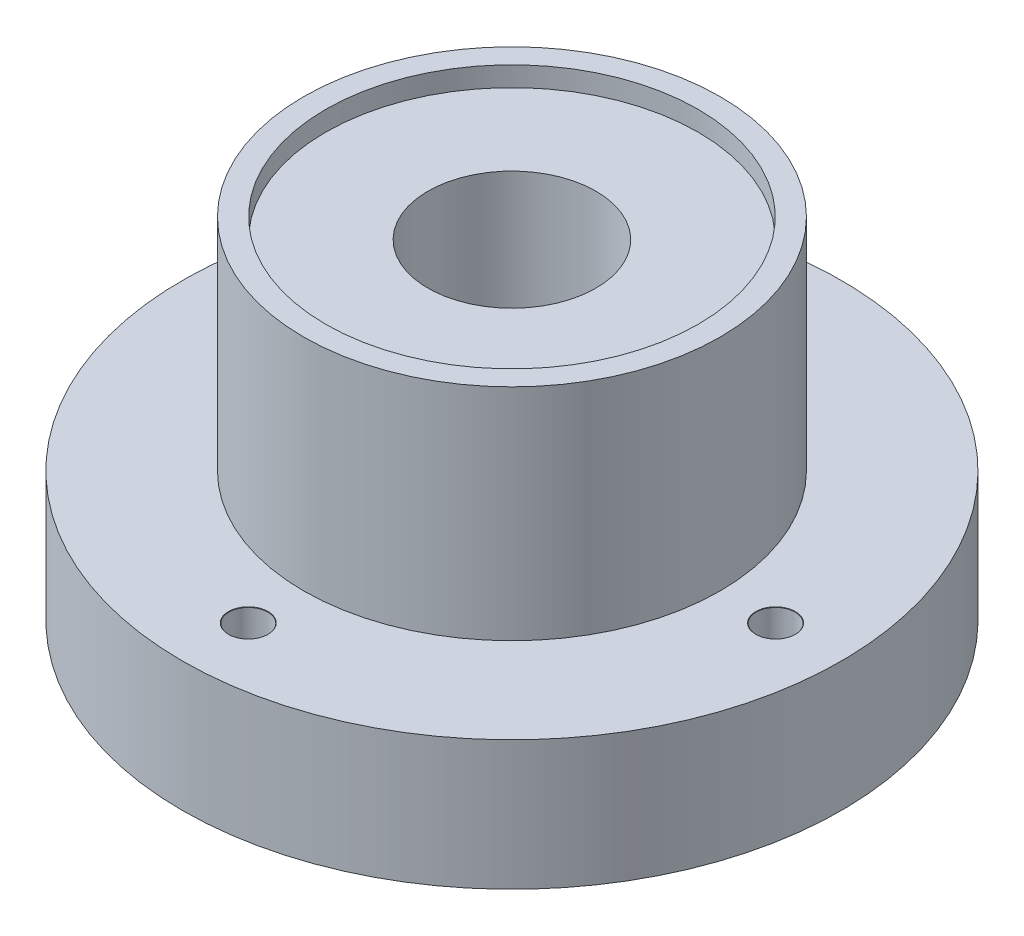
ISO-10303-21;
HEADER;
FILE_DESCRIPTION(('STEP AP214'),'2;1');
FILE_NAME('part.step','',(''),(''),'','','');
FILE_SCHEMA(('AUTOMOTIVE_DESIGN { 1 0 10303 214 1 1 1 1 }'));
ENDSEC;
DATA;
#1=APPLICATION_CONTEXT('core data for automotive mechanical design processes');
#2=APPLICATION_PROTOCOL_DEFINITION('international standard','automotive_design',2000,#1);
#3=PRODUCT_CONTEXT('',#1,'mechanical');
#4=PRODUCT('Part','Part','',(#3));
#5=PRODUCT_RELATED_PRODUCT_CATEGORY('part','',(#4));
#6=PRODUCT_DEFINITION_FORMATION('','',#4);
#7=PRODUCT_DEFINITION_CONTEXT('part definition',#1,'design');
#8=PRODUCT_DEFINITION('design','',#6,#7);
#9=PRODUCT_DEFINITION_SHAPE('','',#8);
#10=(LENGTH_UNIT() NAMED_UNIT(*) SI_UNIT(.MILLI.,.METRE.));
#11=(NAMED_UNIT(*) PLANE_ANGLE_UNIT() SI_UNIT($,.RADIAN.));
#12=(NAMED_UNIT(*) SI_UNIT($,.STERADIAN.) SOLID_ANGLE_UNIT());
#13=UNCERTAINTY_MEASURE_WITH_UNIT(LENGTH_MEASURE(1.E-05),#10,'distance_accuracy_value','');
#14=(GEOMETRIC_REPRESENTATION_CONTEXT(3) GLOBAL_UNCERTAINTY_ASSIGNED_CONTEXT((#13)) GLOBAL_UNIT_ASSIGNED_CONTEXT((#10,
#11,#12)) REPRESENTATION_CONTEXT('',''));
#15=CARTESIAN_POINT('',(0.,0.,0.));
#16=DIRECTION('',(0.,0.,1.));
#17=DIRECTION('',(1.,0.,0.));
#18=AXIS2_PLACEMENT_3D('',#15,#16,#17);
#19=CARTESIAN_POINT('',(0.,25.4,0.));
#20=DIRECTION('',(0.,1.,0.));
#21=DIRECTION('',(0.,0.,1.));
#22=AXIS2_PLACEMENT_3D('',#19,#20,#21);
#23=PLANE('',#22);
#24=CARTESIAN_POINT('',(0.,25.4,0.));
#25=DIRECTION('',(0.,-1.,0.));
#26=DIRECTION('',(0.,0.,-1.));
#27=AXIS2_PLACEMENT_3D('',#24,#25,#26);
#28=CIRCLE('',#27,6.477);
#29=CARTESIAN_POINT('',(0.,25.4,-6.477));
#30=VERTEX_POINT('',#29);
#31=EDGE_CURVE('E62',#30,#30,#28,.T.);
#32=ORIENTED_EDGE('',*,*,#31,.T.);
#33=EDGE_LOOP('',(#32));
#34=FACE_BOUND('',#33,.T.);
#35=CARTESIAN_POINT('',(0.,25.4,0.));
#36=DIRECTION('',(0.,1.,0.));
#37=DIRECTION('',(0.,0.,1.));
#38=AXIS2_PLACEMENT_3D('',#35,#36,#37);
#39=CIRCLE('',#38,14.351);
#40=CARTESIAN_POINT('',(0.,25.4,-14.351));
#41=VERTEX_POINT('',#40);
#42=EDGE_CURVE('E11',#41,#41,#39,.F.);
#43=ORIENTED_EDGE('',*,*,#42,.F.);
#44=EDGE_LOOP('',(#43));
#45=FACE_BOUND('',#44,.T.);
#46=ADVANCED_FACE('F38',(#34,#45),#23,.T.);
#47=CARTESIAN_POINT('',(0.,25.4,0.));
#48=DIRECTION('',(0.,-1.,0.));
#49=DIRECTION('',(0.,0.,-1.));
#50=AXIS2_PLACEMENT_3D('',#47,#48,#49);
#51=CYLINDRICAL_SURFACE('',#50,25.4);
#52=CARTESIAN_POINT('',(0.,0.,0.));
#53=DIRECTION('',(0.,1.,0.));
#54=DIRECTION('',(0.,0.,1.));
#55=AXIS2_PLACEMENT_3D('',#52,#53,#54);
#56=CIRCLE('',#55,25.4);
#57=CARTESIAN_POINT('',(0.,0.,25.4));
#58=VERTEX_POINT('',#57);
#59=EDGE_CURVE('E46',#58,#58,#56,.T.);
#60=ORIENTED_EDGE('',*,*,#59,.T.);
#61=EDGE_LOOP('',(#60));
#62=FACE_BOUND('',#61,.T.);
#63=CARTESIAN_POINT('',(0.,9.978,0.));
#64=DIRECTION('',(0.,1.,0.));
#65=DIRECTION('',(0.,0.,1.));
#66=AXIS2_PLACEMENT_3D('',#63,#64,#65);
#67=CIRCLE('',#66,25.4);
#68=CARTESIAN_POINT('',(0.,9.978,25.4));
#69=VERTEX_POINT('',#68);
#70=EDGE_CURVE('E51',#69,#69,#67,.T.);
#71=ORIENTED_EDGE('',*,*,#70,.F.);
#72=EDGE_LOOP('',(#71));
#73=FACE_BOUND('',#72,.T.);
#74=ADVANCED_FACE('F40',(#62,#73),#51,.T.);
#75=CARTESIAN_POINT('',(0.,0.,0.));
#76=DIRECTION('',(0.,1.,0.));
#77=DIRECTION('',(0.,0.,1.));
#78=AXIS2_PLACEMENT_3D('',#75,#76,#77);
#79=PLANE('',#78);
#80=CARTESIAN_POINT('',(20.32,0.,-2.15329184711745E-13));
#81=DIRECTION('',(0.,1.,0.));
#82=DIRECTION('',(0.,0.,1.));
#83=AXIS2_PLACEMENT_3D('',#80,#81,#82);
#84=CIRCLE('',#83,1.5);
#85=CARTESIAN_POINT('',(20.32,0.,1.49999999999978));
#86=VERTEX_POINT('',#85);
#87=EDGE_CURVE('E114',#86,#86,#84,.T.);
#88=ORIENTED_EDGE('',*,*,#87,.T.);
#89=EDGE_LOOP('',(#88));
#90=FACE_BOUND('',#89,.T.);
#91=CARTESIAN_POINT('',(0.,0.,20.32));
#92=DIRECTION('',(0.,1.,0.));
#93=DIRECTION('',(0.,0.,1.));
#94=AXIS2_PLACEMENT_3D('',#91,#92,#93);
#95=CIRCLE('',#94,1.5);
#96=CARTESIAN_POINT('',(0.,0.,21.82));
#97=VERTEX_POINT('',#96);
#98=EDGE_CURVE('E102',#97,#97,#95,.T.);
#99=ORIENTED_EDGE('',*,*,#98,.T.);
#100=EDGE_LOOP('',(#99));
#101=FACE_BOUND('',#100,.T.);
#102=CARTESIAN_POINT('',(-20.32,0.,0.));
#103=DIRECTION('',(0.,1.,0.));
#104=DIRECTION('',(0.,0.,1.));
#105=AXIS2_PLACEMENT_3D('',#102,#103,#104);
#106=CIRCLE('',#105,1.5);
#107=CARTESIAN_POINT('',(-20.32,0.,1.50000000000007));
#108=VERTEX_POINT('',#107);
#109=EDGE_CURVE('E90',#108,#108,#106,.T.);
#110=ORIENTED_EDGE('',*,*,#109,.T.);
#111=EDGE_LOOP('',(#110));
#112=FACE_BOUND('',#111,.T.);
#113=CARTESIAN_POINT('',(0.,0.,-20.32));
#114=DIRECTION('',(0.,1.,0.));
#115=DIRECTION('',(0.,0.,1.));
#116=AXIS2_PLACEMENT_3D('',#113,#114,#115);
#117=CIRCLE('',#116,1.5);
#118=CARTESIAN_POINT('',(0.,0.,-18.82));
#119=VERTEX_POINT('',#118);
#120=EDGE_CURVE('E78',#119,#119,#117,.T.);
#121=ORIENTED_EDGE('',*,*,#120,.T.);
#122=EDGE_LOOP('',(#121));
#123=FACE_BOUND('',#122,.T.);
#124=CARTESIAN_POINT('',(0.,0.,0.));
#125=DIRECTION('',(0.,-1.,0.));
#126=DIRECTION('',(0.,0.,-1.));
#127=AXIS2_PLACEMENT_3D('',#124,#125,#126);
#128=CIRCLE('',#127,6.477);
#129=CARTESIAN_POINT('',(0.,0.,-6.477));
#130=VERTEX_POINT('',#129);
#131=EDGE_CURVE('E63',#130,#130,#128,.T.);
#132=ORIENTED_EDGE('',*,*,#131,.F.);
#133=EDGE_LOOP('',(#132));
#134=FACE_BOUND('',#133,.T.);
#135=ORIENTED_EDGE('',*,*,#59,.F.);
#136=EDGE_LOOP('',(#135));
#137=FACE_BOUND('',#136,.T.);
#138=ADVANCED_FACE('F133',(#90,#101,#112,#123,#134,#137),#79,.F.);
#139=CARTESIAN_POINT('',(0.,9.978,0.));
#140=DIRECTION('',(0.,1.,0.));
#141=DIRECTION('',(0.,0.,1.));
#142=AXIS2_PLACEMENT_3D('',#139,#140,#141);
#143=PLANE('',#142);
#144=CARTESIAN_POINT('',(20.32,9.978,-2.15329184711745E-13));
#145=DIRECTION('',(0.,1.,0.));
#146=DIRECTION('',(0.,0.,1.));
#147=AXIS2_PLACEMENT_3D('',#144,#145,#146);
#148=CIRCLE('',#147,1.525);
#149=CARTESIAN_POINT('',(20.32,9.978,1.52499999999978));
#150=VERTEX_POINT('',#149);
#151=EDGE_CURVE('E122',#150,#150,#148,.T.);
#152=ORIENTED_EDGE('',*,*,#151,.F.);
#153=EDGE_LOOP('',(#152));
#154=FACE_BOUND('',#153,.T.);
#155=CARTESIAN_POINT('',(0.,9.978,20.32));
#156=DIRECTION('',(0.,1.,0.));
#157=DIRECTION('',(0.,0.,1.));
#158=AXIS2_PLACEMENT_3D('',#155,#156,#157);
#159=CIRCLE('',#158,1.525);
#160=CARTESIAN_POINT('',(0.,9.978,21.845));
#161=VERTEX_POINT('',#160);
#162=EDGE_CURVE('E110',#161,#161,#159,.T.);
#163=ORIENTED_EDGE('',*,*,#162,.F.);
#164=EDGE_LOOP('',(#163));
#165=FACE_BOUND('',#164,.T.);
#166=CARTESIAN_POINT('',(-20.32,9.978,0.));
#167=DIRECTION('',(0.,1.,0.));
#168=DIRECTION('',(0.,0.,1.));
#169=AXIS2_PLACEMENT_3D('',#166,#167,#168);
#170=CIRCLE('',#169,1.525);
#171=CARTESIAN_POINT('',(-20.32,9.978,1.52500000000007));
#172=VERTEX_POINT('',#171);
#173=EDGE_CURVE('E98',#172,#172,#170,.T.);
#174=ORIENTED_EDGE('',*,*,#173,.F.);
#175=EDGE_LOOP('',(#174));
#176=FACE_BOUND('',#175,.T.);
#177=CARTESIAN_POINT('',(0.,9.978,-20.32));
#178=DIRECTION('',(0.,1.,0.));
#179=DIRECTION('',(0.,0.,1.));
#180=AXIS2_PLACEMENT_3D('',#177,#178,#179);
#181=CIRCLE('',#180,1.525);
#182=CARTESIAN_POINT('',(0.,9.978,-18.795));
#183=VERTEX_POINT('',#182);
#184=EDGE_CURVE('E86',#183,#183,#181,.T.);
#185=ORIENTED_EDGE('',*,*,#184,.F.);
#186=EDGE_LOOP('',(#185));
#187=FACE_BOUND('',#186,.T.);
#188=CARTESIAN_POINT('',(0.,9.978,0.));
#189=DIRECTION('',(0.,1.,0.));
#190=DIRECTION('',(0.,0.,1.));
#191=AXIS2_PLACEMENT_3D('',#188,#189,#190);
#192=CIRCLE('',#191,16.05);
#193=CARTESIAN_POINT('',(0.,9.978,16.05));
#194=VERTEX_POINT('',#193);
#195=EDGE_CURVE('E57',#194,#194,#192,.T.);
#196=ORIENTED_EDGE('',*,*,#195,.F.);
#197=EDGE_LOOP('',(#196));
#198=FACE_BOUND('',#197,.T.);
#199=ORIENTED_EDGE('',*,*,#70,.T.);
#200=EDGE_LOOP('',(#199));
#201=FACE_BOUND('',#200,.T.);
#202=ADVANCED_FACE('F129',(#154,#165,#176,#187,#198,#201),#143,.T.);
#203=CARTESIAN_POINT('',(0.,9.978,0.));
#204=DIRECTION('',(0.,1.,0.));
#205=DIRECTION('',(0.,0.,1.));
#206=AXIS2_PLACEMENT_3D('',#203,#204,#205);
#207=CYLINDRICAL_SURFACE('',#206,16.05);
#208=ORIENTED_EDGE('',*,*,#195,.T.);
#209=EDGE_LOOP('',(#208));
#210=FACE_BOUND('',#209,.T.);
#211=CARTESIAN_POINT('',(0.,26.924,0.));
#212=DIRECTION('',(0.,1.,0.));
#213=DIRECTION('',(0.,0.,1.));
#214=AXIS2_PLACEMENT_3D('',#211,#212,#213);
#215=CIRCLE('',#214,16.05);
#216=CARTESIAN_POINT('',(0.,26.924,16.05));
#217=VERTEX_POINT('',#216);
#218=EDGE_CURVE('E67',#217,#217,#215,.T.);
#219=ORIENTED_EDGE('',*,*,#218,.F.);
#220=EDGE_LOOP('',(#219));
#221=FACE_BOUND('',#220,.T.);
#222=ADVANCED_FACE('F132',(#210,#221),#207,.T.);
#223=CARTESIAN_POINT('',(0.,25.4,0.));
#224=DIRECTION('',(0.,-1.,0.));
#225=DIRECTION('',(0.,0.,-1.));
#226=AXIS2_PLACEMENT_3D('',#223,#224,#225);
#227=CYLINDRICAL_SURFACE('',#226,6.477);
#228=ORIENTED_EDGE('',*,*,#31,.F.);
#229=EDGE_LOOP('',(#228));
#230=FACE_BOUND('',#229,.T.);
#231=ORIENTED_EDGE('',*,*,#131,.T.);
#232=EDGE_LOOP('',(#231));
#233=FACE_BOUND('',#232,.T.);
#234=ADVANCED_FACE('F162',(#230,#233),#227,.F.);
#235=CARTESIAN_POINT('',(0.,26.924,0.));
#236=DIRECTION('',(0.,1.,0.));
#237=DIRECTION('',(0.,0.,1.));
#238=AXIS2_PLACEMENT_3D('',#235,#236,#237);
#239=PLANE('',#238);
#240=ORIENTED_EDGE('',*,*,#218,.T.);
#241=EDGE_LOOP('',(#240));
#242=FACE_BOUND('',#241,.T.);
#243=CARTESIAN_POINT('',(0.,26.924,0.));
#244=DIRECTION('',(0.,1.,0.));
#245=DIRECTION('',(0.,0.,1.));
#246=AXIS2_PLACEMENT_3D('',#243,#244,#245);
#247=CIRCLE('',#246,14.351);
#248=CARTESIAN_POINT('',(0.,26.924,-14.351));
#249=VERTEX_POINT('',#248);
#250=EDGE_CURVE('E74',#249,#249,#247,.T.);
#251=ORIENTED_EDGE('',*,*,#250,.F.);
#252=EDGE_LOOP('',(#251));
#253=FACE_BOUND('',#252,.T.);
#254=ADVANCED_FACE('F166',(#242,#253),#239,.T.);
#255=CARTESIAN_POINT('',(0.,26.924,0.));
#256=DIRECTION('',(0.,-1.,0.));
#257=DIRECTION('',(0.,0.,-1.));
#258=AXIS2_PLACEMENT_3D('',#255,#256,#257);
#259=CYLINDRICAL_SURFACE('',#258,14.351);
#260=CARTESIAN_POINT('',(0.,26.924,-14.351));
#261=CARTESIAN_POINT('',(0.,26.908125,-14.351));
#262=CARTESIAN_POINT('',(0.,26.89225,-14.351));
#263=CARTESIAN_POINT('',(0.,26.8605,-14.351));
#264=CARTESIAN_POINT('',(0.,26.844625,-14.351));
#265=CARTESIAN_POINT('',(0.,26.812875,-14.351));
#266=CARTESIAN_POINT('',(0.,26.797,-14.351));
#267=CARTESIAN_POINT('',(0.,26.76525,-14.351));
#268=CARTESIAN_POINT('',(0.,26.749375,-14.351));
#269=CARTESIAN_POINT('',(0.,26.717625,-14.351));
#270=CARTESIAN_POINT('',(0.,26.70175,-14.351));
#271=CARTESIAN_POINT('',(0.,26.67,-14.351));
#272=CARTESIAN_POINT('',(0.,26.654125,-14.351));
#273=CARTESIAN_POINT('',(0.,26.622375,-14.351));
#274=CARTESIAN_POINT('',(0.,26.6065,-14.351));
#275=CARTESIAN_POINT('',(0.,26.57475,-14.351));
#276=CARTESIAN_POINT('',(0.,26.558875,-14.351));
#277=CARTESIAN_POINT('',(0.,26.527125,-14.351));
#278=CARTESIAN_POINT('',(0.,26.51125,-14.351));
#279=CARTESIAN_POINT('',(0.,26.4795,-14.351));
#280=CARTESIAN_POINT('',(0.,26.463625,-14.351));
#281=CARTESIAN_POINT('',(0.,26.431875,-14.351));
#282=CARTESIAN_POINT('',(0.,26.416,-14.351));
#283=CARTESIAN_POINT('',(0.,26.38425,-14.351));
#284=CARTESIAN_POINT('',(0.,26.368375,-14.351));
#285=CARTESIAN_POINT('',(0.,26.336625,-14.351));
#286=CARTESIAN_POINT('',(0.,26.32075,-14.351));
#287=CARTESIAN_POINT('',(0.,26.289,-14.351));
#288=CARTESIAN_POINT('',(0.,26.273125,-14.351));
#289=CARTESIAN_POINT('',(0.,26.241375,-14.351));
#290=CARTESIAN_POINT('',(0.,26.2255,-14.351));
#291=CARTESIAN_POINT('',(0.,26.19375,-14.351));
#292=CARTESIAN_POINT('',(0.,26.177875,-14.351));
#293=CARTESIAN_POINT('',(0.,26.146125,-14.351));
#294=CARTESIAN_POINT('',(0.,26.13025,-14.351));
#295=CARTESIAN_POINT('',(0.,26.0985,-14.351));
#296=CARTESIAN_POINT('',(0.,26.082625,-14.351));
#297=CARTESIAN_POINT('',(0.,26.050875,-14.351));
#298=CARTESIAN_POINT('',(0.,26.035,-14.351));
#299=CARTESIAN_POINT('',(0.,26.00325,-14.351));
#300=CARTESIAN_POINT('',(0.,25.987375,-14.351));
#301=CARTESIAN_POINT('',(0.,25.955625,-14.351));
#302=CARTESIAN_POINT('',(0.,25.93975,-14.351));
#303=CARTESIAN_POINT('',(0.,25.908,-14.351));
#304=CARTESIAN_POINT('',(0.,25.892125,-14.351));
#305=CARTESIAN_POINT('',(0.,25.860375,-14.351));
#306=CARTESIAN_POINT('',(0.,25.8445,-14.351));
#307=CARTESIAN_POINT('',(0.,25.81275,-14.351));
#308=CARTESIAN_POINT('',(0.,25.796875,-14.351));
#309=CARTESIAN_POINT('',(0.,25.765125,-14.351));
#310=CARTESIAN_POINT('',(0.,25.74925,-14.351));
#311=CARTESIAN_POINT('',(0.,25.7175,-14.351));
#312=CARTESIAN_POINT('',(0.,25.701625,-14.351));
#313=CARTESIAN_POINT('',(0.,25.669875,-14.351));
#314=CARTESIAN_POINT('',(0.,25.654,-14.351));
#315=CARTESIAN_POINT('',(0.,25.62225,-14.351));
#316=CARTESIAN_POINT('',(0.,25.606375,-14.351));
#317=CARTESIAN_POINT('',(0.,25.574625,-14.351));
#318=CARTESIAN_POINT('',(0.,25.55875,-14.351));
#319=CARTESIAN_POINT('',(0.,25.527,-14.351));
#320=CARTESIAN_POINT('',(0.,25.511125,-14.351));
#321=CARTESIAN_POINT('',(0.,25.479375,-14.351));
#322=CARTESIAN_POINT('',(0.,25.4635,-14.351));
#323=CARTESIAN_POINT('',(0.,25.43175,-14.351));
#324=CARTESIAN_POINT('',(0.,25.415875,-14.351));
#325=CARTESIAN_POINT('',(0.,25.4,-14.351));
#326=B_SPLINE_CURVE_WITH_KNOTS('',3,(#260,#261,#262,#263,#264,#265,#266,#267,#268,#269,#270,
#271,#272,#273,#274,#275,#276,#277,#278,#279,#280,#281,#282,#283,#284,#285,#286,#287,#288,#289,
#290,#291,#292,#293,#294,#295,#296,#297,#298,#299,#300,#301,#302,#303,#304,#305,#306,#307,#308,
#309,#310,#311,#312,#313,#314,#315,#316,#317,#318,#319,#320,#321,#322,#323,#324,#325),
.UNSPECIFIED.,.F.,.F.,(4,2,2,2,2,2,2,2,2,2,2,2,2,2,2,2,2,2,2,2,2,2,2,2,2,2,2,2,2,2,2,2,4),(0.,
0.0476249999999991,0.0952499999999981,0.142874999999997,0.1905,0.238124999999999,
0.285749999999998,0.333374999999997,0.380999999999999,0.428624999999998,0.476249999999998,
0.523875,0.571499999999999,0.619124999999998,0.666749999999997,0.714375,0.761999999999999,
0.809624999999998,0.85725,0.904874999999999,0.952499999999998,1.000125,1.04775,1.095375,1.143,
1.190625,1.23825,1.285875,1.3335,1.381125,1.42875,1.476375,1.524),.UNSPECIFIED.);
#327=EDGE_CURVE('BSEAM170',#249,#41,#326,.T.);
#328=ORIENTED_EDGE('',*,*,#250,.T.);
#329=ORIENTED_EDGE('',*,*,#42,.T.);
#330=ORIENTED_EDGE('',*,*,#327,.T.);
#331=ORIENTED_EDGE('',*,*,#327,.F.);
#332=EDGE_LOOP('',(#328,#330,#329,#331));
#333=FACE_BOUND('',#332,.T.);
#334=ADVANCED_FACE('F170',(#333),#259,.F.);
#335=CARTESIAN_POINT('',(0.,9.978,-20.32));
#336=DIRECTION('',(0.,1.,0.));
#337=DIRECTION('',(0.,0.,1.));
#338=AXIS2_PLACEMENT_3D('',#335,#336,#337);
#339=CYLINDRICAL_SURFACE('',#338,1.5);
#340=ORIENTED_EDGE('',*,*,#120,.F.);
#341=EDGE_LOOP('',(#340));
#342=FACE_BOUND('',#341,.T.);
#343=CARTESIAN_POINT('',(0.,9.953,-20.32));
#344=DIRECTION('',(0.,1.,0.));
#345=DIRECTION('',(0.,0.,1.));
#346=AXIS2_PLACEMENT_3D('',#343,#344,#345);
#347=CIRCLE('',#346,1.5);
#348=CARTESIAN_POINT('',(0.,9.953,-18.82));
#349=VERTEX_POINT('',#348);
#350=EDGE_CURVE('E82',#349,#349,#347,.T.);
#351=ORIENTED_EDGE('',*,*,#350,.T.);
#352=EDGE_LOOP('',(#351));
#353=FACE_BOUND('',#352,.T.);
#354=ADVANCED_FACE('F174',(#342,#353),#339,.F.);
#355=CARTESIAN_POINT('',(0.,9.978,-20.32));
#356=DIRECTION('',(0.,1.,0.));
#357=DIRECTION('',(0.,0.,1.));
#358=AXIS2_PLACEMENT_3D('',#355,#356,#357);
#359=CONICAL_SURFACE('',#358,1.525,0.785398163397422);
#360=ORIENTED_EDGE('',*,*,#350,.F.);
#361=EDGE_LOOP('',(#360));
#362=FACE_BOUND('',#361,.T.);
#363=ORIENTED_EDGE('',*,*,#184,.T.);
#364=EDGE_LOOP('',(#363));
#365=FACE_BOUND('',#364,.T.);
#366=ADVANCED_FACE('F178',(#362,#365),#359,.F.);
#367=CARTESIAN_POINT('',(-20.32,9.978,0.));
#368=DIRECTION('',(0.,1.,0.));
#369=DIRECTION('',(0.,0.,1.));
#370=AXIS2_PLACEMENT_3D('',#367,#368,#369);
#371=CYLINDRICAL_SURFACE('',#370,1.5);
#372=ORIENTED_EDGE('',*,*,#109,.F.);
#373=EDGE_LOOP('',(#372));
#374=FACE_BOUND('',#373,.T.);
#375=CARTESIAN_POINT('',(-20.32,9.953,0.));
#376=DIRECTION('',(0.,1.,0.));
#377=DIRECTION('',(0.,0.,1.));
#378=AXIS2_PLACEMENT_3D('',#375,#376,#377);
#379=CIRCLE('',#378,1.5);
#380=CARTESIAN_POINT('',(-20.32,9.953,1.50000000000007));
#381=VERTEX_POINT('',#380);
#382=EDGE_CURVE('E94',#381,#381,#379,.T.);
#383=ORIENTED_EDGE('',*,*,#382,.T.);
#384=EDGE_LOOP('',(#383));
#385=FACE_BOUND('',#384,.T.);
#386=ADVANCED_FACE('F182',(#374,#385),#371,.F.);
#387=CARTESIAN_POINT('',(-20.32,9.978,0.));
#388=DIRECTION('',(0.,1.,0.));
#389=DIRECTION('',(0.,0.,1.));
#390=AXIS2_PLACEMENT_3D('',#387,#388,#389);
#391=CONICAL_SURFACE('',#390,1.525,0.785398163397414);
#392=ORIENTED_EDGE('',*,*,#382,.F.);
#393=EDGE_LOOP('',(#392));
#394=FACE_BOUND('',#393,.T.);
#395=ORIENTED_EDGE('',*,*,#173,.T.);
#396=EDGE_LOOP('',(#395));
#397=FACE_BOUND('',#396,.T.);
#398=ADVANCED_FACE('F186',(#394,#397),#391,.F.);
#399=CARTESIAN_POINT('',(0.,9.978,20.32));
#400=DIRECTION('',(0.,1.,0.));
#401=DIRECTION('',(0.,0.,1.));
#402=AXIS2_PLACEMENT_3D('',#399,#400,#401);
#403=CYLINDRICAL_SURFACE('',#402,1.5);
#404=ORIENTED_EDGE('',*,*,#98,.F.);
#405=EDGE_LOOP('',(#404));
#406=FACE_BOUND('',#405,.T.);
#407=CARTESIAN_POINT('',(0.,9.953,20.32));
#408=DIRECTION('',(0.,1.,0.));
#409=DIRECTION('',(0.,0.,1.));
#410=AXIS2_PLACEMENT_3D('',#407,#408,#409);
#411=CIRCLE('',#410,1.5);
#412=CARTESIAN_POINT('',(0.,9.953,21.82));
#413=VERTEX_POINT('',#412);
#414=EDGE_CURVE('E106',#413,#413,#411,.T.);
#415=ORIENTED_EDGE('',*,*,#414,.T.);
#416=EDGE_LOOP('',(#415));
#417=FACE_BOUND('',#416,.T.);
#418=ADVANCED_FACE('F190',(#406,#417),#403,.F.);
#419=CARTESIAN_POINT('',(0.,9.978,20.32));
#420=DIRECTION('',(0.,1.,0.));
#421=DIRECTION('',(0.,0.,1.));
#422=AXIS2_PLACEMENT_3D('',#419,#420,#421);
#423=CONICAL_SURFACE('',#422,1.525,0.785398163397422);
#424=ORIENTED_EDGE('',*,*,#414,.F.);
#425=EDGE_LOOP('',(#424));
#426=FACE_BOUND('',#425,.T.);
#427=ORIENTED_EDGE('',*,*,#162,.T.);
#428=EDGE_LOOP('',(#427));
#429=FACE_BOUND('',#428,.T.);
#430=ADVANCED_FACE('F194',(#426,#429),#423,.F.);
#431=CARTESIAN_POINT('',(20.32,9.978,-2.15329184711745E-13));
#432=DIRECTION('',(0.,1.,0.));
#433=DIRECTION('',(0.,0.,1.));
#434=AXIS2_PLACEMENT_3D('',#431,#432,#433);
#435=CYLINDRICAL_SURFACE('',#434,1.5);
#436=ORIENTED_EDGE('',*,*,#87,.F.);
#437=EDGE_LOOP('',(#436));
#438=FACE_BOUND('',#437,.T.);
#439=CARTESIAN_POINT('',(20.32,9.953,-2.15329184711745E-13));
#440=DIRECTION('',(0.,1.,0.));
#441=DIRECTION('',(0.,0.,1.));
#442=AXIS2_PLACEMENT_3D('',#439,#440,#441);
#443=CIRCLE('',#442,1.5);
#444=CARTESIAN_POINT('',(20.32,9.953,1.49999999999978));
#445=VERTEX_POINT('',#444);
#446=EDGE_CURVE('E118',#445,#445,#443,.T.);
#447=ORIENTED_EDGE('',*,*,#446,.T.);
#448=EDGE_LOOP('',(#447));
#449=FACE_BOUND('',#448,.T.);
#450=ADVANCED_FACE('F198',(#438,#449),#435,.F.);
#451=CARTESIAN_POINT('',(20.32,9.978,-2.15329184711745E-13));
#452=DIRECTION('',(0.,1.,0.));
#453=DIRECTION('',(0.,0.,1.));
#454=AXIS2_PLACEMENT_3D('',#451,#452,#453);
#455=CONICAL_SURFACE('',#454,1.525,0.785398163397414);
#456=ORIENTED_EDGE('',*,*,#446,.F.);
#457=EDGE_LOOP('',(#456));
#458=FACE_BOUND('',#457,.T.);
#459=ORIENTED_EDGE('',*,*,#151,.T.);
#460=EDGE_LOOP('',(#459));
#461=FACE_BOUND('',#460,.T.);
#462=ADVANCED_FACE('F127',(#458,#461),#455,.F.);
#463=CLOSED_SHELL('',(#46,#74,#138,#202,#222,#234,#254,#334,#354,#366,#386,#398,#418,#430,#450,#462));
#464=MANIFOLD_SOLID_BREP('B2',#463);
#465=ADVANCED_BREP_SHAPE_REPRESENTATION('',(#18,#464),#14);
#466=SHAPE_DEFINITION_REPRESENTATION(#9,#465);
ENDSEC;
END-ISO-10303-21;
